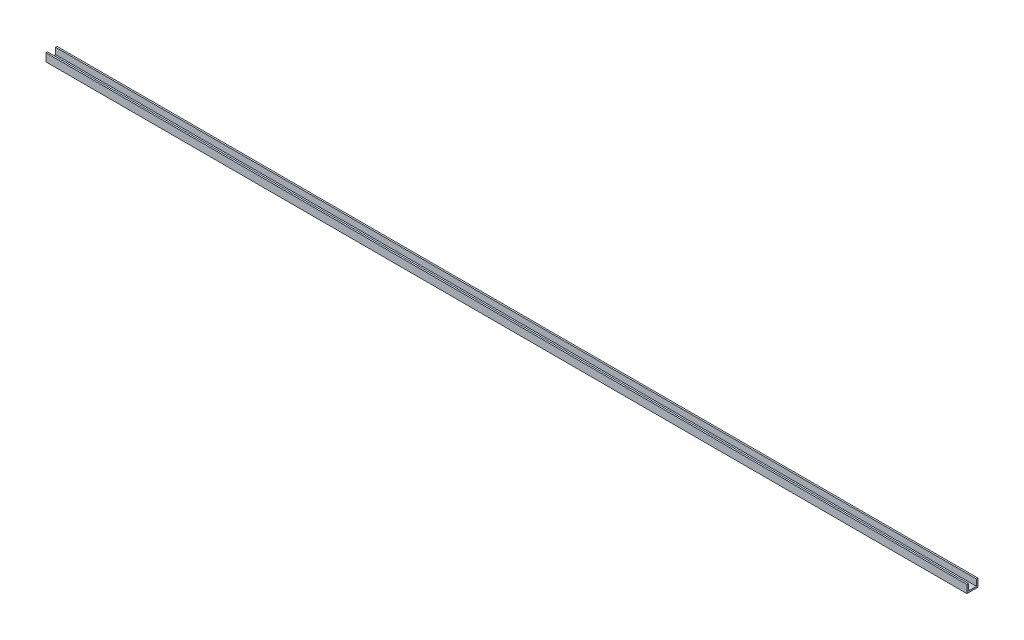
ISO-10303-21;
HEADER;
FILE_DESCRIPTION(('STEP AP214'),'2;1');
FILE_NAME('part.step','',(''),(''),'','','');
FILE_SCHEMA(('AUTOMOTIVE_DESIGN { 1 0 10303 214 1 1 1 1 }'));
ENDSEC;
DATA;
#1=APPLICATION_CONTEXT('core data for automotive mechanical design processes');
#2=APPLICATION_PROTOCOL_DEFINITION('international standard','automotive_design',2000,#1);
#3=PRODUCT_CONTEXT('',#1,'mechanical');
#4=PRODUCT('Part','Part','',(#3));
#5=PRODUCT_RELATED_PRODUCT_CATEGORY('part','',(#4));
#6=PRODUCT_DEFINITION_FORMATION('','',#4);
#7=PRODUCT_DEFINITION_CONTEXT('part definition',#1,'design');
#8=PRODUCT_DEFINITION('design','',#6,#7);
#9=PRODUCT_DEFINITION_SHAPE('','',#8);
#10=(LENGTH_UNIT() NAMED_UNIT(*) SI_UNIT(.MILLI.,.METRE.));
#11=(NAMED_UNIT(*) PLANE_ANGLE_UNIT() SI_UNIT($,.RADIAN.));
#12=(NAMED_UNIT(*) SI_UNIT($,.STERADIAN.) SOLID_ANGLE_UNIT());
#13=UNCERTAINTY_MEASURE_WITH_UNIT(LENGTH_MEASURE(1.E-05),#10,'distance_accuracy_value','');
#14=(GEOMETRIC_REPRESENTATION_CONTEXT(3) GLOBAL_UNCERTAINTY_ASSIGNED_CONTEXT((#13)) GLOBAL_UNIT_ASSIGNED_CONTEXT((#10,
#11,#12)) REPRESENTATION_CONTEXT('',''));
#15=CARTESIAN_POINT('',(0.,0.,0.));
#16=DIRECTION('',(0.,0.,1.));
#17=DIRECTION('',(1.,0.,0.));
#18=AXIS2_PLACEMENT_3D('',#15,#16,#17);
#19=CARTESIAN_POINT('',(580.,5.,3.5));
#20=DIRECTION('',(0.,0.,-1.));
#21=DIRECTION('',(0.,1.,0.));
#22=AXIS2_PLACEMENT_3D('',#19,#20,#21);
#23=PLANE('',#22);
#24=DIRECTION('',(0.,-1.,0.));
#25=VECTOR('',#24,1.);
#26=CARTESIAN_POINT('',(0.,5.,3.5));
#27=LINE('',#26,#25);
#28=CARTESIAN_POINT('',(0.,5.,3.5));
#29=VERTEX_POINT('',#28);
#30=CARTESIAN_POINT('',(0.,0.,3.5));
#31=VERTEX_POINT('',#30);
#32=EDGE_CURVE('E129',#29,#31,#27,.T.);
#33=ORIENTED_EDGE('',*,*,#32,.T.);
#34=DIRECTION('',(-1.,0.,0.));
#35=VECTOR('',#34,1.);
#36=CARTESIAN_POINT('',(580.,0.,3.5));
#37=LINE('',#36,#35);
#38=CARTESIAN_POINT('',(580.,0.,3.5));
#39=VERTEX_POINT('',#38);
#40=EDGE_CURVE('E11',#39,#31,#37,.T.);
#41=ORIENTED_EDGE('',*,*,#40,.F.);
#42=DIRECTION('',(0.,-1.,0.));
#43=VECTOR('',#42,1.);
#44=CARTESIAN_POINT('',(580.,5.,3.5));
#45=LINE('',#44,#43);
#46=CARTESIAN_POINT('',(580.,5.,3.5));
#47=VERTEX_POINT('',#46);
#48=EDGE_CURVE('E143',#47,#39,#45,.T.);
#49=ORIENTED_EDGE('',*,*,#48,.F.);
#50=DIRECTION('',(-1.,0.,0.));
#51=VECTOR('',#50,1.);
#52=CARTESIAN_POINT('',(580.,5.,3.5));
#53=LINE('',#52,#51);
#54=EDGE_CURVE('E125',#47,#29,#53,.T.);
#55=ORIENTED_EDGE('',*,*,#54,.T.);
#56=EDGE_LOOP('',(#33,#41,#49,#55));
#57=FACE_BOUND('',#56,.T.);
#58=ADVANCED_FACE('F33',(#57),#23,.F.);
#59=CARTESIAN_POINT('',(580.,0.,3.5));
#60=DIRECTION('',(0.,1.,0.));
#61=DIRECTION('',(0.,0.,1.));
#62=AXIS2_PLACEMENT_3D('',#59,#60,#61);
#63=PLANE('',#62);
#64=DIRECTION('',(0.,0.,-1.));
#65=VECTOR('',#64,1.);
#66=CARTESIAN_POINT('',(0.,0.,3.5));
#67=LINE('',#66,#65);
#68=CARTESIAN_POINT('',(0.,0.,-3.5));
#69=VERTEX_POINT('',#68);
#70=EDGE_CURVE('E132',#31,#69,#67,.T.);
#71=ORIENTED_EDGE('',*,*,#70,.T.);
#72=DIRECTION('',(-1.,0.,0.));
#73=VECTOR('',#72,1.);
#74=CARTESIAN_POINT('',(580.,0.,-3.5));
#75=LINE('',#74,#73);
#76=CARTESIAN_POINT('',(580.,0.,-3.5));
#77=VERTEX_POINT('',#76);
#78=EDGE_CURVE('E41',#77,#69,#75,.T.);
#79=ORIENTED_EDGE('',*,*,#78,.F.);
#80=DIRECTION('',(0.,0.,-1.));
#81=VECTOR('',#80,1.);
#82=CARTESIAN_POINT('',(580.,0.,3.5));
#83=LINE('',#82,#81);
#84=EDGE_CURVE('E92',#39,#77,#83,.T.);
#85=ORIENTED_EDGE('',*,*,#84,.F.);
#86=ORIENTED_EDGE('',*,*,#40,.T.);
#87=EDGE_LOOP('',(#71,#79,#85,#86));
#88=FACE_BOUND('',#87,.T.);
#89=ADVANCED_FACE('F178',(#88),#63,.F.);
#90=CARTESIAN_POINT('',(580.,0.,-3.5));
#91=DIRECTION('',(0.,0.,1.));
#92=DIRECTION('',(0.,-1.,0.));
#93=AXIS2_PLACEMENT_3D('',#90,#91,#92);
#94=PLANE('',#93);
#95=DIRECTION('',(0.,1.,0.));
#96=VECTOR('',#95,1.);
#97=CARTESIAN_POINT('',(0.,0.,-3.5));
#98=LINE('',#97,#96);
#99=CARTESIAN_POINT('',(0.,5.,-3.5));
#100=VERTEX_POINT('',#99);
#101=EDGE_CURVE('E134',#69,#100,#98,.T.);
#102=ORIENTED_EDGE('',*,*,#101,.T.);
#103=DIRECTION('',(-1.,0.,0.));
#104=VECTOR('',#103,1.);
#105=CARTESIAN_POINT('',(580.,5.,-3.5));
#106=LINE('',#105,#104);
#107=CARTESIAN_POINT('',(580.,5.,-3.5));
#108=VERTEX_POINT('',#107);
#109=EDGE_CURVE('E150',#108,#100,#106,.T.);
#110=ORIENTED_EDGE('',*,*,#109,.F.);
#111=DIRECTION('',(0.,1.,0.));
#112=VECTOR('',#111,1.);
#113=CARTESIAN_POINT('',(580.,0.,-3.5));
#114=LINE('',#113,#112);
#115=EDGE_CURVE('E158',#77,#108,#114,.T.);
#116=ORIENTED_EDGE('',*,*,#115,.F.);
#117=ORIENTED_EDGE('',*,*,#78,.T.);
#118=EDGE_LOOP('',(#102,#110,#116,#117));
#119=FACE_BOUND('',#118,.T.);
#120=ADVANCED_FACE('F156',(#119),#94,.F.);
#121=CARTESIAN_POINT('',(580.,5.,-3.5));
#122=DIRECTION('',(0.,-1.,0.));
#123=DIRECTION('',(0.,0.,-1.));
#124=AXIS2_PLACEMENT_3D('',#121,#122,#123);
#125=PLANE('',#124);
#126=DIRECTION('',(0.,0.,1.));
#127=VECTOR('',#126,1.);
#128=CARTESIAN_POINT('',(0.,5.,-3.5));
#129=LINE('',#128,#127);
#130=CARTESIAN_POINT('',(0.,5.,-2.5));
#131=VERTEX_POINT('',#130);
#132=EDGE_CURVE('E136',#100,#131,#129,.T.);
#133=ORIENTED_EDGE('',*,*,#132,.T.);
#134=DIRECTION('',(-1.,0.,0.));
#135=VECTOR('',#134,1.);
#136=CARTESIAN_POINT('',(580.,5.,-2.5));
#137=LINE('',#136,#135);
#138=CARTESIAN_POINT('',(580.,5.,-2.5));
#139=VERTEX_POINT('',#138);
#140=EDGE_CURVE('E147',#139,#131,#137,.T.);
#141=ORIENTED_EDGE('',*,*,#140,.F.);
#142=DIRECTION('',(0.,0.,1.));
#143=VECTOR('',#142,1.);
#144=CARTESIAN_POINT('',(580.,5.,-3.5));
#145=LINE('',#144,#143);
#146=EDGE_CURVE('E170',#108,#139,#145,.T.);
#147=ORIENTED_EDGE('',*,*,#146,.F.);
#148=ORIENTED_EDGE('',*,*,#109,.T.);
#149=EDGE_LOOP('',(#133,#141,#147,#148));
#150=FACE_BOUND('',#149,.T.);
#151=ADVANCED_FACE('F166',(#150),#125,.F.);
#152=CARTESIAN_POINT('',(580.,5.,-2.5));
#153=DIRECTION('',(0.,0.,-1.));
#154=DIRECTION('',(0.,1.,0.));
#155=AXIS2_PLACEMENT_3D('',#152,#153,#154);
#156=PLANE('',#155);
#157=DIRECTION('',(0.,-1.,0.));
#158=VECTOR('',#157,1.);
#159=CARTESIAN_POINT('',(0.,5.,-2.5));
#160=LINE('',#159,#158);
#161=CARTESIAN_POINT('',(0.,1.,-2.5));
#162=VERTEX_POINT('',#161);
#163=EDGE_CURVE('E138',#131,#162,#160,.T.);
#164=ORIENTED_EDGE('',*,*,#163,.T.);
#165=DIRECTION('',(-1.,0.,0.));
#166=VECTOR('',#165,1.);
#167=CARTESIAN_POINT('',(580.,1.,-2.5));
#168=LINE('',#167,#166);
#169=CARTESIAN_POINT('',(580.,1.,-2.5));
#170=VERTEX_POINT('',#169);
#171=EDGE_CURVE('E120',#170,#162,#168,.T.);
#172=ORIENTED_EDGE('',*,*,#171,.F.);
#173=DIRECTION('',(0.,-1.,0.));
#174=VECTOR('',#173,1.);
#175=CARTESIAN_POINT('',(580.,5.,-2.5));
#176=LINE('',#175,#174);
#177=EDGE_CURVE('E111',#139,#170,#176,.T.);
#178=ORIENTED_EDGE('',*,*,#177,.F.);
#179=ORIENTED_EDGE('',*,*,#140,.T.);
#180=EDGE_LOOP('',(#164,#172,#178,#179));
#181=FACE_BOUND('',#180,.T.);
#182=ADVANCED_FACE('F169',(#181),#156,.F.);
#183=CARTESIAN_POINT('',(580.,1.,-2.5));
#184=DIRECTION('',(0.,-1.,0.));
#185=DIRECTION('',(0.,0.,-1.));
#186=AXIS2_PLACEMENT_3D('',#183,#184,#185);
#187=PLANE('',#186);
#188=DIRECTION('',(0.,0.,1.));
#189=VECTOR('',#188,1.);
#190=CARTESIAN_POINT('',(0.,1.,-2.5));
#191=LINE('',#190,#189);
#192=CARTESIAN_POINT('',(0.,1.,2.5));
#193=VERTEX_POINT('',#192);
#194=EDGE_CURVE('E119',#162,#193,#191,.T.);
#195=ORIENTED_EDGE('',*,*,#194,.T.);
#196=DIRECTION('',(-1.,0.,0.));
#197=VECTOR('',#196,1.);
#198=CARTESIAN_POINT('',(580.,1.,2.5));
#199=LINE('',#198,#197);
#200=CARTESIAN_POINT('',(580.,1.,2.5));
#201=VERTEX_POINT('',#200);
#202=EDGE_CURVE('E116',#201,#193,#199,.T.);
#203=ORIENTED_EDGE('',*,*,#202,.F.);
#204=DIRECTION('',(0.,0.,1.));
#205=VECTOR('',#204,1.);
#206=CARTESIAN_POINT('',(580.,1.,-2.5));
#207=LINE('',#206,#205);
#208=EDGE_CURVE('E105',#170,#201,#207,.T.);
#209=ORIENTED_EDGE('',*,*,#208,.F.);
#210=ORIENTED_EDGE('',*,*,#171,.T.);
#211=EDGE_LOOP('',(#195,#203,#209,#210));
#212=FACE_BOUND('',#211,.T.);
#213=ADVANCED_FACE('F117',(#212),#187,.F.);
#214=CARTESIAN_POINT('',(580.,1.,2.5));
#215=DIRECTION('',(0.,0.,1.));
#216=DIRECTION('',(1.,0.,0.));
#217=AXIS2_PLACEMENT_3D('',#214,#215,#216);
#218=PLANE('',#217);
#219=DIRECTION('',(0.,1.,0.));
#220=VECTOR('',#219,1.);
#221=CARTESIAN_POINT('',(0.,1.,2.5));
#222=LINE('',#221,#220);
#223=CARTESIAN_POINT('',(0.,5.,2.5));
#224=VERTEX_POINT('',#223);
#225=EDGE_CURVE('E78',#193,#224,#222,.T.);
#226=ORIENTED_EDGE('',*,*,#225,.T.);
#227=DIRECTION('',(-1.,0.,0.));
#228=VECTOR('',#227,1.);
#229=CARTESIAN_POINT('',(580.,5.,2.5));
#230=LINE('',#229,#228);
#231=CARTESIAN_POINT('',(580.,5.,2.5));
#232=VERTEX_POINT('',#231);
#233=EDGE_CURVE('E121',#232,#224,#230,.T.);
#234=ORIENTED_EDGE('',*,*,#233,.F.);
#235=DIRECTION('',(0.,1.,0.));
#236=VECTOR('',#235,1.);
#237=CARTESIAN_POINT('',(580.,1.,2.5));
#238=LINE('',#237,#236);
#239=EDGE_CURVE('E109',#201,#232,#238,.T.);
#240=ORIENTED_EDGE('',*,*,#239,.F.);
#241=ORIENTED_EDGE('',*,*,#202,.T.);
#242=EDGE_LOOP('',(#226,#234,#240,#241));
#243=FACE_BOUND('',#242,.T.);
#244=ADVANCED_FACE('F123',(#243),#218,.F.);
#245=CARTESIAN_POINT('',(580.,5.,2.5));
#246=DIRECTION('',(0.,-1.,0.));
#247=DIRECTION('',(0.,0.,-1.));
#248=AXIS2_PLACEMENT_3D('',#245,#246,#247);
#249=PLANE('',#248);
#250=DIRECTION('',(0.,0.,1.));
#251=VECTOR('',#250,1.);
#252=CARTESIAN_POINT('',(0.,5.,2.5));
#253=LINE('',#252,#251);
#254=EDGE_CURVE('E84',#224,#29,#253,.T.);
#255=ORIENTED_EDGE('',*,*,#254,.T.);
#256=ORIENTED_EDGE('',*,*,#54,.F.);
#257=DIRECTION('',(0.,0.,1.));
#258=VECTOR('',#257,1.);
#259=CARTESIAN_POINT('',(580.,5.,2.5));
#260=LINE('',#259,#258);
#261=EDGE_CURVE('E49',#232,#47,#260,.T.);
#262=ORIENTED_EDGE('',*,*,#261,.F.);
#263=ORIENTED_EDGE('',*,*,#233,.T.);
#264=EDGE_LOOP('',(#255,#256,#262,#263));
#265=FACE_BOUND('',#264,.T.);
#266=ADVANCED_FACE('F194',(#265),#249,.F.);
#267=CARTESIAN_POINT('',(580.,0.,0.));
#268=DIRECTION('',(1.,0.,0.));
#269=DIRECTION('',(0.,0.,-1.));
#270=AXIS2_PLACEMENT_3D('',#267,#268,#269);
#271=PLANE('',#270);
#272=ORIENTED_EDGE('',*,*,#48,.T.);
#273=ORIENTED_EDGE('',*,*,#84,.T.);
#274=ORIENTED_EDGE('',*,*,#115,.T.);
#275=ORIENTED_EDGE('',*,*,#146,.T.);
#276=ORIENTED_EDGE('',*,*,#177,.T.);
#277=ORIENTED_EDGE('',*,*,#208,.T.);
#278=ORIENTED_EDGE('',*,*,#239,.T.);
#279=ORIENTED_EDGE('',*,*,#261,.T.);
#280=EDGE_LOOP('',(#272,#273,#274,#275,#276,#277,#278,#279));
#281=FACE_BOUND('',#280,.T.);
#282=ADVANCED_FACE('F107',(#281),#271,.T.);
#283=CARTESIAN_POINT('',(0.,0.,0.));
#284=DIRECTION('',(1.,0.,0.));
#285=DIRECTION('',(0.,0.,-1.));
#286=AXIS2_PLACEMENT_3D('',#283,#284,#285);
#287=PLANE('',#286);
#288=ORIENTED_EDGE('',*,*,#32,.F.);
#289=ORIENTED_EDGE('',*,*,#254,.F.);
#290=ORIENTED_EDGE('',*,*,#225,.F.);
#291=ORIENTED_EDGE('',*,*,#194,.F.);
#292=ORIENTED_EDGE('',*,*,#163,.F.);
#293=ORIENTED_EDGE('',*,*,#132,.F.);
#294=ORIENTED_EDGE('',*,*,#101,.F.);
#295=ORIENTED_EDGE('',*,*,#70,.F.);
#296=EDGE_LOOP('',(#288,#289,#290,#291,#292,#293,#294,#295));
#297=FACE_BOUND('',#296,.T.);
#298=ADVANCED_FACE('F162',(#297),#287,.F.);
#299=CLOSED_SHELL('',(#58,#89,#120,#151,#182,#213,#244,#266,#282,#298));
#300=MANIFOLD_SOLID_BREP('B2',#299);
#301=ADVANCED_BREP_SHAPE_REPRESENTATION('',(#18,#300),#14);
#302=SHAPE_DEFINITION_REPRESENTATION(#9,#301);
ENDSEC;
END-ISO-10303-21;
